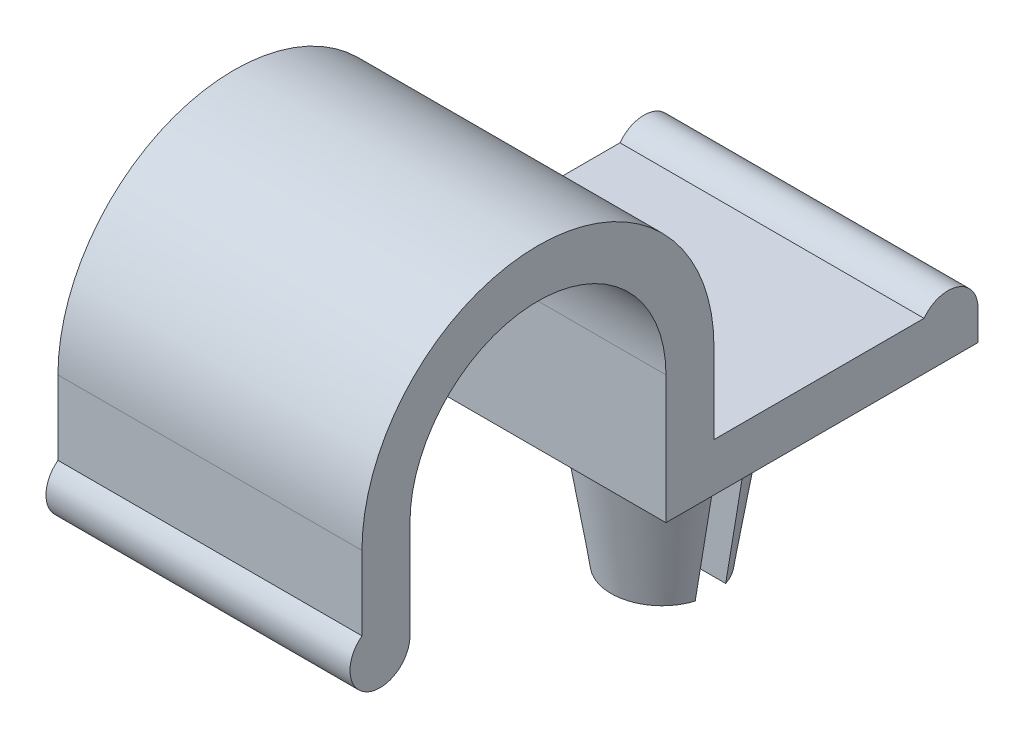
ISO-10303-21;
HEADER;
FILE_DESCRIPTION(('STEP AP214'),'2;1');
FILE_NAME('part.step','',(''),(''),'','','');
FILE_SCHEMA(('AUTOMOTIVE_DESIGN { 1 0 10303 214 1 1 1 1 }'));
ENDSEC;
DATA;
#1=APPLICATION_CONTEXT('core data for automotive mechanical design processes');
#2=APPLICATION_PROTOCOL_DEFINITION('international standard','automotive_design',2000,#1);
#3=PRODUCT_CONTEXT('',#1,'mechanical');
#4=PRODUCT('Part','Part','',(#3));
#5=PRODUCT_RELATED_PRODUCT_CATEGORY('part','',(#4));
#6=PRODUCT_DEFINITION_FORMATION('','',#4);
#7=PRODUCT_DEFINITION_CONTEXT('part definition',#1,'design');
#8=PRODUCT_DEFINITION('design','',#6,#7);
#9=PRODUCT_DEFINITION_SHAPE('','',#8);
#10=(LENGTH_UNIT() NAMED_UNIT(*) SI_UNIT(.MILLI.,.METRE.));
#11=(NAMED_UNIT(*) PLANE_ANGLE_UNIT() SI_UNIT($,.RADIAN.));
#12=(NAMED_UNIT(*) SI_UNIT($,.STERADIAN.) SOLID_ANGLE_UNIT());
#13=UNCERTAINTY_MEASURE_WITH_UNIT(LENGTH_MEASURE(1.E-05),#10,'distance_accuracy_value','');
#14=(GEOMETRIC_REPRESENTATION_CONTEXT(3) GLOBAL_UNCERTAINTY_ASSIGNED_CONTEXT((#13)) GLOBAL_UNIT_ASSIGNED_CONTEXT((#10,
#11,#12)) REPRESENTATION_CONTEXT('',''));
#15=CARTESIAN_POINT('',(0.,0.,0.));
#16=DIRECTION('',(0.,0.,1.));
#17=DIRECTION('',(1.,0.,0.));
#18=AXIS2_PLACEMENT_3D('',#15,#16,#17);
#19=CARTESIAN_POINT('',(0.,-4.851,-5.15));
#20=DIRECTION('',(0.,1.,0.));
#21=DIRECTION('',(0.,0.,1.));
#22=AXIS2_PLACEMENT_3D('',#19,#20,#21);
#23=PLANE('',#22);
#24=DIRECTION('',(-1.,0.,0.));
#25=VECTOR('',#24,1.);
#26=CARTESIAN_POINT('',(0.,-4.851,-7.281));
#27=LINE('',#26,#25);
#28=CARTESIAN_POINT('',(1.7080219553624,-4.851,-7.281));
#29=VERTEX_POINT('',#28);
#30=CARTESIAN_POINT('',(1.45080632752963,-4.851,-7.281));
#31=VERTEX_POINT('',#30);
#32=EDGE_CURVE('E281',#29,#31,#27,.T.);
#33=ORIENTED_EDGE('',*,*,#32,.F.);
#34=CARTESIAN_POINT('',(0.,-4.851,-6.9));
#35=DIRECTION('',(0.,-1.,0.));
#36=DIRECTION('',(0.,0.,-1.));
#37=AXIS2_PLACEMENT_3D('',#34,#35,#36);
#38=CIRCLE('',#37,1.75);
#39=CARTESIAN_POINT('',(-1.7080219553624,-4.851,-7.281));
#40=VERTEX_POINT('',#39);
#41=EDGE_CURVE('E301',#40,#29,#38,.T.);
#42=ORIENTED_EDGE('',*,*,#41,.F.);
#43=CARTESIAN_POINT('',(-1.45080632752963,-4.851,-7.281));
#44=VERTEX_POINT('',#43);
#45=EDGE_CURVE('E285',#44,#40,#27,.T.);
#46=ORIENTED_EDGE('',*,*,#45,.F.);
#47=CARTESIAN_POINT('',(0.,-4.851,-6.9));
#48=DIRECTION('',(0.,-1.,0.));
#49=DIRECTION('',(0.,0.,-1.));
#50=AXIS2_PLACEMENT_3D('',#47,#48,#49);
#51=CIRCLE('',#50,1.5);
#52=EDGE_CURVE('E305',#44,#31,#51,.T.);
#53=ORIENTED_EDGE('',*,*,#52,.T.);
#54=EDGE_LOOP('',(#33,#42,#46,#53));
#55=FACE_BOUND('',#54,.T.);
#56=ADVANCED_FACE('F36',(#55),#23,.T.);
#57=CARTESIAN_POINT('',(0.,-7.851,-6.9));
#58=DIRECTION('',(0.,1.,0.));
#59=DIRECTION('',(0.,0.,1.));
#60=AXIS2_PLACEMENT_3D('',#57,#58,#59);
#61=CONICAL_SURFACE('',#60,1.27,0.158655262186401);
#62=CARTESIAN_POINT('',(-0.890278523595278,-9.73613459988966,-7.281));
#63=CARTESIAN_POINT('',(-0.938041432508905,-9.46150185775553,-7.281));
#64=CARTESIAN_POINT('',(-0.985293739056163,-9.18678117733999,-7.281));
#65=CARTESIAN_POINT('',(-1.07903998334567,-8.63721103151004,-7.281));
#66=CARTESIAN_POINT('',(-1.12553392297273,-8.36236156641744,-7.281));
#67=CARTESIAN_POINT('',(-1.20641442373388,-7.88160254737788,-7.281));
#68=CARTESIAN_POINT('',(-1.24090973672328,-7.67571123061958,-7.281));
#69=CARTESIAN_POINT('',(-1.33840204237879,-7.09190160372883,-7.281));
#70=CARTESIAN_POINT('',(-1.40113905922128,-6.71393986590751,-7.281));
#71=CARTESIAN_POINT('',(-1.5261278012019,-5.95793592096705,-7.281));
#72=CARTESIAN_POINT('',(-1.5883795258562,-5.57989371376807,-7.281));
#73=CARTESIAN_POINT('',(-1.76609832110471,-4.4976408297803,-7.281));
#74=CARTESIAN_POINT('',(-1.88115016206371,-3.79336198928885,-7.281));
#75=CARTESIAN_POINT('',(-2.11060056427418,-2.38469774926164,-7.281));
#76=CARTESIAN_POINT('',(-2.22499912521735,-1.68031234967576,-7.281));
#77=CARTESIAN_POINT('',(-2.45338420312815,-0.271480262471609,-7.281));
#78=CARTESIAN_POINT('',(-2.56737072321955,0.432966424640384,-7.281));
#79=CARTESIAN_POINT('',(-2.79505928200441,1.84190503750387,-7.281));
#80=CARTESIAN_POINT('',(-2.9087613209902,2.54639696320811,-7.281));
#81=CARTESIAN_POINT('',(-3.02238458080445,3.25090153245999,-7.281));
#82=B_SPLINE_CURVE_WITH_KNOTS('',3,(#62,#63,#64,#65,#66,#67,#68,#69,#70,#71,#72,#73,#74,#75,#76,
#77,#78,#79,#80,#81),.UNSPECIFIED.,.F.,.F.,(4,2,2,2,2,2,2,2,2,4),(0.,0.836263797797176,
1.6725255168779,2.2988084845141,3.44820731588795,4.59760729303429,6.73845001030268,
8.87929373787069,11.0201212011299,13.1609464635406),.UNSPECIFIED.);
#83=CARTESIAN_POINT('',(-1.21150278579952,-7.851,-7.281));
#84=VERTEX_POINT('',#83);
#85=EDGE_CURVE('E287',#40,#84,#82,.F.);
#86=ORIENTED_EDGE('',*,*,#85,.F.);
#87=ORIENTED_EDGE('',*,*,#41,.T.);
#88=CARTESIAN_POINT('',(0.890278523595278,-9.73613459988966,-7.281));
#89=CARTESIAN_POINT('',(0.938041432508905,-9.46150185775553,-7.281));
#90=CARTESIAN_POINT('',(0.985293739056163,-9.18678117733999,-7.281));
#91=CARTESIAN_POINT('',(1.07903998334567,-8.63721103151004,-7.281));
#92=CARTESIAN_POINT('',(1.12553392297273,-8.36236156641744,-7.281));
#93=CARTESIAN_POINT('',(1.20641442373388,-7.88160254737788,-7.281));
#94=CARTESIAN_POINT('',(1.24090973672328,-7.67571123061958,-7.281));
#95=CARTESIAN_POINT('',(1.33840204237879,-7.09190160372883,-7.281));
#96=CARTESIAN_POINT('',(1.40113905922128,-6.71393986590751,-7.281));
#97=CARTESIAN_POINT('',(1.5261278012019,-5.95793592096705,-7.281));
#98=CARTESIAN_POINT('',(1.5883795258562,-5.57989371376807,-7.281));
#99=CARTESIAN_POINT('',(1.76609832110471,-4.4976408297803,-7.281));
#100=CARTESIAN_POINT('',(1.88115016206371,-3.79336198928885,-7.281));
#101=CARTESIAN_POINT('',(2.11060056427418,-2.38469774926164,-7.281));
#102=CARTESIAN_POINT('',(2.22499912521735,-1.68031234967576,-7.281));
#103=CARTESIAN_POINT('',(2.45338420312815,-0.271480262471609,-7.281));
#104=CARTESIAN_POINT('',(2.56737072321955,0.432966424640384,-7.281));
#105=CARTESIAN_POINT('',(2.79505928200441,1.84190503750387,-7.281));
#106=CARTESIAN_POINT('',(2.9087613209902,2.54639696320811,-7.281));
#107=CARTESIAN_POINT('',(3.02238458080445,3.25090153245999,-7.281));
#108=B_SPLINE_CURVE_WITH_KNOTS('',3,(#88,#89,#90,#91,#92,#93,#94,#95,#96,#97,#98,#99,#100,#101,
#102,#103,#104,#105,#106,#107),.UNSPECIFIED.,.F.,.F.,(4,2,2,2,2,2,2,2,2,4),(0.,
0.836263797797176,1.6725255168779,2.2988084845141,3.44820731588795,4.59760729303429,
6.73845001030268,8.87929373787069,11.0201212011299,13.1609464635406),.UNSPECIFIED.);
#109=CARTESIAN_POINT('',(1.21150278579952,-7.851,-7.281));
#110=VERTEX_POINT('',#109);
#111=EDGE_CURVE('E274',#110,#29,#108,.T.);
#112=ORIENTED_EDGE('',*,*,#111,.F.);
#113=CARTESIAN_POINT('',(0.,-7.851,-6.9));
#114=DIRECTION('',(0.,-1.,0.));
#115=DIRECTION('',(0.,0.,-1.));
#116=AXIS2_PLACEMENT_3D('',#113,#114,#115);
#117=CIRCLE('',#116,1.27);
#118=EDGE_CURVE('E297',#84,#110,#117,.T.);
#119=ORIENTED_EDGE('',*,*,#118,.F.);
#120=EDGE_LOOP('',(#86,#87,#112,#119));
#121=FACE_BOUND('',#120,.T.);
#122=ADVANCED_FACE('F269',(#121),#61,.T.);
#123=CARTESIAN_POINT('',(0.,-7.851,-6.9));
#124=DIRECTION('',(0.,-1.,0.));
#125=DIRECTION('',(0.,0.,-1.));
#126=AXIS2_PLACEMENT_3D('',#123,#124,#125);
#127=PLANE('',#126);
#128=DIRECTION('',(1.,0.,0.));
#129=VECTOR('',#128,1.);
#130=CARTESIAN_POINT('',(0.,-7.851,-7.281));
#131=LINE('',#130,#129);
#132=EDGE_CURVE('E217',#84,#110,#131,.T.);
#133=ORIENTED_EDGE('',*,*,#132,.F.);
#134=ORIENTED_EDGE('',*,*,#118,.T.);
#135=EDGE_LOOP('',(#133,#134));
#136=FACE_BOUND('',#135,.T.);
#137=ADVANCED_FACE('F371',(#136),#127,.T.);
#138=CARTESIAN_POINT('',(-3.8,-3.2,-3.2));
#139=DIRECTION('',(0.,1.,0.));
#140=DIRECTION('',(0.,0.,1.));
#141=AXIS2_PLACEMENT_3D('',#138,#139,#140);
#142=PLANE('',#141);
#143=CARTESIAN_POINT('',(0.,-3.2,-6.9));
#144=DIRECTION('',(0.,-1.,0.));
#145=DIRECTION('',(0.,0.,-1.));
#146=AXIS2_PLACEMENT_3D('',#143,#144,#145);
#147=CIRCLE('',#146,1.5);
#148=CARTESIAN_POINT('',(0.,-3.2,-8.4));
#149=VERTEX_POINT('',#148);
#150=EDGE_CURVE('E173',#149,#149,#147,.T.);
#151=ORIENTED_EDGE('',*,*,#150,.F.);
#152=EDGE_LOOP('',(#151));
#153=FACE_BOUND('',#152,.T.);
#154=DIRECTION('',(0.,0.,1.));
#155=VECTOR('',#154,1.);
#156=CARTESIAN_POINT('',(3.8,-3.2,-3.2));
#157=LINE('',#156,#155);
#158=CARTESIAN_POINT('',(3.8,-3.2,-11.));
#159=VERTEX_POINT('',#158);
#160=CARTESIAN_POINT('',(3.8,-3.2,-3.2));
#161=VERTEX_POINT('',#160);
#162=EDGE_CURVE('E169',#159,#161,#157,.T.);
#163=ORIENTED_EDGE('',*,*,#162,.T.);
#164=DIRECTION('',(1.,0.,0.));
#165=VECTOR('',#164,1.);
#166=CARTESIAN_POINT('',(-3.8,-3.2,-3.2));
#167=LINE('',#166,#165);
#168=CARTESIAN_POINT('',(-3.8,-3.2,-3.2));
#169=VERTEX_POINT('',#168);
#170=EDGE_CURVE('E213',#169,#161,#167,.T.);
#171=ORIENTED_EDGE('',*,*,#170,.F.);
#172=DIRECTION('',(0.,0.,1.));
#173=VECTOR('',#172,1.);
#174=CARTESIAN_POINT('',(-3.8,-3.2,-3.2));
#175=LINE('',#174,#173);
#176=CARTESIAN_POINT('',(-3.8,-3.2,-11.));
#177=VERTEX_POINT('',#176);
#178=EDGE_CURVE('E191',#177,#169,#175,.T.);
#179=ORIENTED_EDGE('',*,*,#178,.F.);
#180=DIRECTION('',(1.,0.,0.));
#181=VECTOR('',#180,1.);
#182=CARTESIAN_POINT('',(-3.8,-3.2,-11.));
#183=LINE('',#182,#181);
#184=EDGE_CURVE('E165',#177,#159,#183,.T.);
#185=ORIENTED_EDGE('',*,*,#184,.T.);
#186=EDGE_LOOP('',(#163,#171,#179,#185));
#187=FACE_BOUND('',#186,.T.);
#188=ADVANCED_FACE('F38',(#153,#187),#142,.F.);
#189=CARTESIAN_POINT('',(-3.8,0.,-3.2));
#190=DIRECTION('',(0.,0.,-1.));
#191=DIRECTION('',(0.,1.,0.));
#192=AXIS2_PLACEMENT_3D('',#189,#190,#191);
#193=PLANE('',#192);
#194=DIRECTION('',(0.,1.,0.));
#195=VECTOR('',#194,1.);
#196=CARTESIAN_POINT('',(3.8,0.,-3.2));
#197=LINE('',#196,#195);
#198=CARTESIAN_POINT('',(3.8,0.,-3.2));
#199=VERTEX_POINT('',#198);
#200=EDGE_CURVE('E172',#161,#199,#197,.T.);
#201=ORIENTED_EDGE('',*,*,#200,.T.);
#202=DIRECTION('',(1.,0.,0.));
#203=VECTOR('',#202,1.);
#204=CARTESIAN_POINT('',(-3.8,0.,-3.2));
#205=LINE('',#204,#203);
#206=CARTESIAN_POINT('',(-3.8,0.,-3.2));
#207=VERTEX_POINT('',#206);
#208=EDGE_CURVE('E210',#207,#199,#205,.T.);
#209=ORIENTED_EDGE('',*,*,#208,.F.);
#210=DIRECTION('',(0.,1.,0.));
#211=VECTOR('',#210,1.);
#212=CARTESIAN_POINT('',(-3.8,0.,-3.2));
#213=LINE('',#212,#211);
#214=EDGE_CURVE('E117',#169,#207,#213,.T.);
#215=ORIENTED_EDGE('',*,*,#214,.F.);
#216=ORIENTED_EDGE('',*,*,#170,.T.);
#217=EDGE_LOOP('',(#201,#209,#215,#216));
#218=FACE_BOUND('',#217,.T.);
#219=ADVANCED_FACE('F341',(#218),#193,.F.);
#220=CARTESIAN_POINT('',(-3.8,0.,0.));
#221=DIRECTION('',(1.,0.,0.));
#222=DIRECTION('',(0.,0.,-1.));
#223=AXIS2_PLACEMENT_3D('',#220,#221,#222);
#224=CYLINDRICAL_SURFACE('',#223,3.2);
#225=CARTESIAN_POINT('',(3.8,0.,0.));
#226=DIRECTION('',(1.,0.,0.));
#227=DIRECTION('',(0.,0.,1.));
#228=AXIS2_PLACEMENT_3D('',#225,#226,#227);
#229=CIRCLE('',#228,3.2);
#230=CARTESIAN_POINT('',(3.8,0.,3.2));
#231=VERTEX_POINT('',#230);
#232=EDGE_CURVE('E175',#199,#231,#229,.T.);
#233=ORIENTED_EDGE('',*,*,#232,.T.);
#234=DIRECTION('',(1.,0.,0.));
#235=VECTOR('',#234,1.);
#236=CARTESIAN_POINT('',(-3.8,0.,3.2));
#237=LINE('',#236,#235);
#238=CARTESIAN_POINT('',(-3.8,0.,3.2));
#239=VERTEX_POINT('',#238);
#240=EDGE_CURVE('E207',#239,#231,#237,.T.);
#241=ORIENTED_EDGE('',*,*,#240,.F.);
#242=CARTESIAN_POINT('',(-3.8,0.,0.));
#243=DIRECTION('',(1.,0.,0.));
#244=DIRECTION('',(0.,0.,1.));
#245=AXIS2_PLACEMENT_3D('',#242,#243,#244);
#246=CIRCLE('',#245,3.2);
#247=EDGE_CURVE('E313',#207,#239,#246,.T.);
#248=ORIENTED_EDGE('',*,*,#247,.F.);
#249=ORIENTED_EDGE('',*,*,#208,.T.);
#250=EDGE_LOOP('',(#233,#241,#248,#249));
#251=FACE_BOUND('',#250,.T.);
#252=ADVANCED_FACE('F344',(#251),#224,.F.);
#253=CARTESIAN_POINT('',(-3.8,0.,3.2));
#254=DIRECTION('',(0.,0.,1.));
#255=DIRECTION('',(0.,-1.,0.));
#256=AXIS2_PLACEMENT_3D('',#253,#254,#255);
#257=PLANE('',#256);
#258=DIRECTION('',(0.,-1.,0.));
#259=VECTOR('',#258,1.);
#260=CARTESIAN_POINT('',(3.8,0.,3.2));
#261=LINE('',#260,#259);
#262=CARTESIAN_POINT('',(3.8,-2.45,3.2));
#263=VERTEX_POINT('',#262);
#264=EDGE_CURVE('E177',#231,#263,#261,.T.);
#265=ORIENTED_EDGE('',*,*,#264,.T.);
#266=DIRECTION('',(1.,0.,0.));
#267=VECTOR('',#266,1.);
#268=CARTESIAN_POINT('',(-3.8,-2.45,3.2));
#269=LINE('',#268,#267);
#270=CARTESIAN_POINT('',(-3.8,-2.45,3.2));
#271=VERTEX_POINT('',#270);
#272=EDGE_CURVE('E204',#271,#263,#269,.T.);
#273=ORIENTED_EDGE('',*,*,#272,.F.);
#274=DIRECTION('',(0.,-1.,0.));
#275=VECTOR('',#274,1.);
#276=CARTESIAN_POINT('',(-3.8,0.,3.2));
#277=LINE('',#276,#275);
#278=EDGE_CURVE('E315',#239,#271,#277,.T.);
#279=ORIENTED_EDGE('',*,*,#278,.F.);
#280=ORIENTED_EDGE('',*,*,#240,.T.);
#281=EDGE_LOOP('',(#265,#273,#279,#280));
#282=FACE_BOUND('',#281,.T.);
#283=ADVANCED_FACE('F349',(#282),#257,.F.);
#284=CARTESIAN_POINT('',(-3.8,-2.45,3.95));
#285=DIRECTION('',(1.,0.,0.));
#286=DIRECTION('',(0.,0.,-1.));
#287=AXIS2_PLACEMENT_3D('',#284,#285,#286);
#288=CYLINDRICAL_SURFACE('',#287,0.75);
#289=CARTESIAN_POINT('',(3.8,-2.45,3.95));
#290=DIRECTION('',(-1.,0.,0.));
#291=DIRECTION('',(0.,0.,1.));
#292=AXIS2_PLACEMENT_3D('',#289,#290,#291);
#293=CIRCLE('',#292,0.75);
#294=CARTESIAN_POINT('',(3.8,-1.85,4.4));
#295=VERTEX_POINT('',#294);
#296=EDGE_CURVE('E179',#263,#295,#293,.T.);
#297=ORIENTED_EDGE('',*,*,#296,.T.);
#298=DIRECTION('',(1.,0.,0.));
#299=VECTOR('',#298,1.);
#300=CARTESIAN_POINT('',(-3.8,-1.85,4.4));
#301=LINE('',#300,#299);
#302=CARTESIAN_POINT('',(-3.8,-1.85,4.4));
#303=VERTEX_POINT('',#302);
#304=EDGE_CURVE('E201',#303,#295,#301,.T.);
#305=ORIENTED_EDGE('',*,*,#304,.F.);
#306=CARTESIAN_POINT('',(-3.8,-2.45,3.95));
#307=DIRECTION('',(-1.,0.,0.));
#308=DIRECTION('',(0.,0.,1.));
#309=AXIS2_PLACEMENT_3D('',#306,#307,#308);
#310=CIRCLE('',#309,0.75);
#311=EDGE_CURVE('E317',#271,#303,#310,.T.);
#312=ORIENTED_EDGE('',*,*,#311,.F.);
#313=ORIENTED_EDGE('',*,*,#272,.T.);
#314=EDGE_LOOP('',(#297,#305,#312,#313));
#315=FACE_BOUND('',#314,.T.);
#316=ADVANCED_FACE('F353',(#315),#288,.T.);
#317=CARTESIAN_POINT('',(-3.8,0.,4.4));
#318=DIRECTION('',(0.,0.,-1.));
#319=DIRECTION('',(-1.,0.,0.));
#320=AXIS2_PLACEMENT_3D('',#317,#318,#319);
#321=PLANE('',#320);
#322=DIRECTION('',(0.,1.,0.));
#323=VECTOR('',#322,1.);
#324=CARTESIAN_POINT('',(3.8,0.,4.4));
#325=LINE('',#324,#323);
#326=CARTESIAN_POINT('',(3.8,0.,4.4));
#327=VERTEX_POINT('',#326);
#328=EDGE_CURVE('E181',#295,#327,#325,.T.);
#329=ORIENTED_EDGE('',*,*,#328,.T.);
#330=DIRECTION('',(1.,0.,0.));
#331=VECTOR('',#330,1.);
#332=CARTESIAN_POINT('',(-3.8,0.,4.4));
#333=LINE('',#332,#331);
#334=CARTESIAN_POINT('',(-3.8,0.,4.4));
#335=VERTEX_POINT('',#334);
#336=EDGE_CURVE('E198',#335,#327,#333,.T.);
#337=ORIENTED_EDGE('',*,*,#336,.F.);
#338=DIRECTION('',(0.,1.,0.));
#339=VECTOR('',#338,1.);
#340=CARTESIAN_POINT('',(-3.8,0.,4.4));
#341=LINE('',#340,#339);
#342=EDGE_CURVE('E319',#303,#335,#341,.T.);
#343=ORIENTED_EDGE('',*,*,#342,.F.);
#344=ORIENTED_EDGE('',*,*,#304,.T.);
#345=EDGE_LOOP('',(#329,#337,#343,#344));
#346=FACE_BOUND('',#345,.T.);
#347=ADVANCED_FACE('F357',(#346),#321,.F.);
#348=CARTESIAN_POINT('',(-3.8,0.,0.));
#349=DIRECTION('',(1.,0.,0.));
#350=DIRECTION('',(0.,0.,-1.));
#351=AXIS2_PLACEMENT_3D('',#348,#349,#350);
#352=CYLINDRICAL_SURFACE('',#351,4.4);
#353=CARTESIAN_POINT('',(3.8,0.,0.));
#354=DIRECTION('',(-1.,0.,0.));
#355=DIRECTION('',(0.,0.,1.));
#356=AXIS2_PLACEMENT_3D('',#353,#354,#355);
#357=CIRCLE('',#356,4.4);
#358=CARTESIAN_POINT('',(3.8,0.,-4.4));
#359=VERTEX_POINT('',#358);
#360=EDGE_CURVE('E183',#327,#359,#357,.T.);
#361=ORIENTED_EDGE('',*,*,#360,.T.);
#362=DIRECTION('',(1.,0.,0.));
#363=VECTOR('',#362,1.);
#364=CARTESIAN_POINT('',(-3.8,0.,-4.4));
#365=LINE('',#364,#363);
#366=CARTESIAN_POINT('',(-3.8,0.,-4.4));
#367=VERTEX_POINT('',#366);
#368=EDGE_CURVE('E195',#367,#359,#365,.T.);
#369=ORIENTED_EDGE('',*,*,#368,.F.);
#370=CARTESIAN_POINT('',(-3.8,0.,0.));
#371=DIRECTION('',(-1.,0.,0.));
#372=DIRECTION('',(0.,0.,1.));
#373=AXIS2_PLACEMENT_3D('',#370,#371,#372);
#374=CIRCLE('',#373,4.4);
#375=EDGE_CURVE('E321',#335,#367,#374,.T.);
#376=ORIENTED_EDGE('',*,*,#375,.F.);
#377=ORIENTED_EDGE('',*,*,#336,.T.);
#378=EDGE_LOOP('',(#361,#369,#376,#377));
#379=FACE_BOUND('',#378,.T.);
#380=ADVANCED_FACE('F327',(#379),#352,.T.);
#381=CARTESIAN_POINT('',(-3.8,0.,-4.4));
#382=DIRECTION('',(0.,0.,1.));
#383=DIRECTION('',(1.,0.,0.));
#384=AXIS2_PLACEMENT_3D('',#381,#382,#383);
#385=PLANE('',#384);
#386=DIRECTION('',(0.,-1.,0.));
#387=VECTOR('',#386,1.);
#388=CARTESIAN_POINT('',(3.8,0.,-4.4));
#389=LINE('',#388,#387);
#390=CARTESIAN_POINT('',(3.8,-2.,-4.4));
#391=VERTEX_POINT('',#390);
#392=EDGE_CURVE('E185',#359,#391,#389,.T.);
#393=ORIENTED_EDGE('',*,*,#392,.T.);
#394=DIRECTION('',(1.,0.,0.));
#395=VECTOR('',#394,1.);
#396=CARTESIAN_POINT('',(-3.8,-2.,-4.4));
#397=LINE('',#396,#395);
#398=CARTESIAN_POINT('',(-3.8,-2.,-4.4));
#399=VERTEX_POINT('',#398);
#400=EDGE_CURVE('E160',#399,#391,#397,.T.);
#401=ORIENTED_EDGE('',*,*,#400,.F.);
#402=DIRECTION('',(0.,-1.,0.));
#403=VECTOR('',#402,1.);
#404=CARTESIAN_POINT('',(-3.8,0.,-4.4));
#405=LINE('',#404,#403);
#406=EDGE_CURVE('E148',#367,#399,#405,.T.);
#407=ORIENTED_EDGE('',*,*,#406,.F.);
#408=ORIENTED_EDGE('',*,*,#368,.T.);
#409=EDGE_LOOP('',(#393,#401,#407,#408));
#410=FACE_BOUND('',#409,.T.);
#411=ADVANCED_FACE('F331',(#410),#385,.F.);
#412=CARTESIAN_POINT('',(-3.8,-2.,-9.65));
#413=DIRECTION('',(0.,-1.,0.));
#414=DIRECTION('',(0.,0.,-1.));
#415=AXIS2_PLACEMENT_3D('',#412,#413,#414);
#416=PLANE('',#415);
#417=DIRECTION('',(0.,0.,-1.));
#418=VECTOR('',#417,1.);
#419=CARTESIAN_POINT('',(3.8,-2.,-9.65));
#420=LINE('',#419,#418);
#421=CARTESIAN_POINT('',(3.8,-2.,-9.65));
#422=VERTEX_POINT('',#421);
#423=EDGE_CURVE('E157',#391,#422,#420,.T.);
#424=ORIENTED_EDGE('',*,*,#423,.T.);
#425=DIRECTION('',(1.,0.,0.));
#426=VECTOR('',#425,1.);
#427=CARTESIAN_POINT('',(-3.8,-2.,-9.65));
#428=LINE('',#427,#426);
#429=CARTESIAN_POINT('',(-3.8,-2.,-9.65));
#430=VERTEX_POINT('',#429);
#431=EDGE_CURVE('E154',#430,#422,#428,.T.);
#432=ORIENTED_EDGE('',*,*,#431,.F.);
#433=DIRECTION('',(0.,0.,-1.));
#434=VECTOR('',#433,1.);
#435=CARTESIAN_POINT('',(-3.8,-2.,-9.65));
#436=LINE('',#435,#434);
#437=EDGE_CURVE('E141',#399,#430,#436,.T.);
#438=ORIENTED_EDGE('',*,*,#437,.F.);
#439=ORIENTED_EDGE('',*,*,#400,.T.);
#440=EDGE_LOOP('',(#424,#432,#438,#439));
#441=FACE_BOUND('',#440,.T.);
#442=ADVANCED_FACE('F155',(#441),#416,.F.);
#443=CARTESIAN_POINT('',(-3.8,-2.45,-10.25));
#444=DIRECTION('',(1.,0.,0.));
#445=DIRECTION('',(0.,0.,-1.));
#446=AXIS2_PLACEMENT_3D('',#443,#444,#445);
#447=CYLINDRICAL_SURFACE('',#446,0.750000000000001);
#448=CARTESIAN_POINT('',(3.8,-2.45,-10.25));
#449=DIRECTION('',(-1.,0.,0.));
#450=DIRECTION('',(0.,0.,1.));
#451=AXIS2_PLACEMENT_3D('',#448,#449,#450);
#452=CIRCLE('',#451,0.750000000000001);
#453=CARTESIAN_POINT('',(3.8,-2.45,-11.));
#454=VERTEX_POINT('',#453);
#455=EDGE_CURVE('E188',#422,#454,#452,.T.);
#456=ORIENTED_EDGE('',*,*,#455,.T.);
#457=DIRECTION('',(1.,0.,0.));
#458=VECTOR('',#457,1.);
#459=CARTESIAN_POINT('',(-3.8,-2.45,-11.));
#460=LINE('',#459,#458);
#461=CARTESIAN_POINT('',(-3.8,-2.45,-11.));
#462=VERTEX_POINT('',#461);
#463=EDGE_CURVE('E161',#462,#454,#460,.T.);
#464=ORIENTED_EDGE('',*,*,#463,.F.);
#465=CARTESIAN_POINT('',(-3.8,-2.45,-10.25));
#466=DIRECTION('',(-1.,0.,0.));
#467=DIRECTION('',(0.,0.,1.));
#468=AXIS2_PLACEMENT_3D('',#465,#466,#467);
#469=CIRCLE('',#468,0.750000000000001);
#470=EDGE_CURVE('E145',#430,#462,#469,.T.);
#471=ORIENTED_EDGE('',*,*,#470,.F.);
#472=ORIENTED_EDGE('',*,*,#431,.T.);
#473=EDGE_LOOP('',(#456,#464,#471,#472));
#474=FACE_BOUND('',#473,.T.);
#475=ADVANCED_FACE('F163',(#474),#447,.T.);
#476=CARTESIAN_POINT('',(-3.8,-3.2,-11.));
#477=DIRECTION('',(0.,0.,1.));
#478=DIRECTION('',(1.,0.,0.));
#479=AXIS2_PLACEMENT_3D('',#476,#477,#478);
#480=PLANE('',#479);
#481=DIRECTION('',(0.,-1.,0.));
#482=VECTOR('',#481,1.);
#483=CARTESIAN_POINT('',(3.8,-3.2,-11.));
#484=LINE('',#483,#482);
#485=EDGE_CURVE('E108',#454,#159,#484,.T.);
#486=ORIENTED_EDGE('',*,*,#485,.T.);
#487=ORIENTED_EDGE('',*,*,#184,.F.);
#488=DIRECTION('',(0.,-1.,0.));
#489=VECTOR('',#488,1.);
#490=CARTESIAN_POINT('',(-3.8,-3.2,-11.));
#491=LINE('',#490,#489);
#492=EDGE_CURVE('E66',#462,#177,#491,.T.);
#493=ORIENTED_EDGE('',*,*,#492,.F.);
#494=ORIENTED_EDGE('',*,*,#463,.T.);
#495=EDGE_LOOP('',(#486,#487,#493,#494));
#496=FACE_BOUND('',#495,.T.);
#497=ADVANCED_FACE('F335',(#496),#480,.F.);
#498=CARTESIAN_POINT('',(-3.8,-2.45,-10.25));
#499=DIRECTION('',(-1.,0.,0.));
#500=DIRECTION('',(0.,0.,1.));
#501=AXIS2_PLACEMENT_3D('',#498,#499,#500);
#502=PLANE('',#501);
#503=ORIENTED_EDGE('',*,*,#178,.T.);
#504=ORIENTED_EDGE('',*,*,#214,.T.);
#505=ORIENTED_EDGE('',*,*,#247,.T.);
#506=ORIENTED_EDGE('',*,*,#278,.T.);
#507=ORIENTED_EDGE('',*,*,#311,.T.);
#508=ORIENTED_EDGE('',*,*,#342,.T.);
#509=ORIENTED_EDGE('',*,*,#375,.T.);
#510=ORIENTED_EDGE('',*,*,#406,.T.);
#511=ORIENTED_EDGE('',*,*,#437,.T.);
#512=ORIENTED_EDGE('',*,*,#470,.T.);
#513=ORIENTED_EDGE('',*,*,#492,.T.);
#514=EDGE_LOOP('',(#503,#504,#505,#506,#507,#508,#509,#510,#511,#512,#513));
#515=FACE_BOUND('',#514,.T.);
#516=ADVANCED_FACE('F143',(#515),#502,.T.);
#517=CARTESIAN_POINT('',(3.8,-2.45,-10.25));
#518=DIRECTION('',(-1.,0.,0.));
#519=DIRECTION('',(0.,0.,1.));
#520=AXIS2_PLACEMENT_3D('',#517,#518,#519);
#521=PLANE('',#520);
#522=ORIENTED_EDGE('',*,*,#162,.F.);
#523=ORIENTED_EDGE('',*,*,#485,.F.);
#524=ORIENTED_EDGE('',*,*,#455,.F.);
#525=ORIENTED_EDGE('',*,*,#423,.F.);
#526=ORIENTED_EDGE('',*,*,#392,.F.);
#527=ORIENTED_EDGE('',*,*,#360,.F.);
#528=ORIENTED_EDGE('',*,*,#328,.F.);
#529=ORIENTED_EDGE('',*,*,#296,.F.);
#530=ORIENTED_EDGE('',*,*,#264,.F.);
#531=ORIENTED_EDGE('',*,*,#232,.F.);
#532=ORIENTED_EDGE('',*,*,#200,.F.);
#533=EDGE_LOOP('',(#522,#523,#524,#525,#526,#527,#528,#529,#530,#531,#532));
#534=FACE_BOUND('',#533,.T.);
#535=ADVANCED_FACE('F334',(#534),#521,.F.);
#536=CARTESIAN_POINT('',(0.,-3.2,-6.9));
#537=DIRECTION('',(0.,-1.,0.));
#538=DIRECTION('',(0.,0.,-1.));
#539=AXIS2_PLACEMENT_3D('',#536,#537,#538);
#540=CYLINDRICAL_SURFACE('',#539,1.5);
#541=DIRECTION('',(0.,-1.,0.));
#542=VECTOR('',#541,1.);
#543=CARTESIAN_POINT('',(-1.45080632752963,-3.2,-7.281));
#544=LINE('',#543,#542);
#545=CARTESIAN_POINT('',(-1.45080632752963,-3.787,-7.281));
#546=VERTEX_POINT('',#545);
#547=EDGE_CURVE('E294',#546,#44,#544,.T.);
#548=ORIENTED_EDGE('',*,*,#547,.F.);
#549=CARTESIAN_POINT('',(-1.45080632752963,-3.787,-6.519));
#550=CARTESIAN_POINT('',(-1.45078805876325,-3.76593359163224,-6.51898021181437));
#551=CARTESIAN_POINT('',(-1.4512647036703,-3.74488063931606,-6.52074585101482));
#552=CARTESIAN_POINT('',(-1.45306907413241,-3.70342626932325,-6.52769226470349));
#553=CARTESIAN_POINT('',(-1.45439503358234,-3.68302359164113,-6.53286595296493));
#554=CARTESIAN_POINT('',(-1.45776015815194,-3.64340447992512,-6.54647314204933));
#555=CARTESIAN_POINT('',(-1.45979924303376,-3.62418791272117,-6.5549062761445));
#556=CARTESIAN_POINT('',(-1.46435421314104,-3.58743462279419,-6.57477546122427));
#557=CARTESIAN_POINT('',(-1.46687023312475,-3.56989837696027,-6.58621236127753));
#558=CARTESIAN_POINT('',(-1.47216033231567,-3.53661386536997,-6.61204069978887));
#559=CARTESIAN_POINT('',(-1.47493861873509,-3.52090920936623,-6.62648748921445));
#560=CARTESIAN_POINT('',(-1.48040366347713,-3.49211663337953,-6.65780717349287));
#561=CARTESIAN_POINT('',(-1.48309040706132,-3.47902913312345,-6.67468045675038));
#562=CARTESIAN_POINT('',(-1.4881164369874,-3.45566331265285,-6.71067518731065));
#563=CARTESIAN_POINT('',(-1.49045015165085,-3.44542824222815,-6.72982555564943));
#564=CARTESIAN_POINT('',(-1.49445872551434,-3.42833965007128,-6.76964325557795));
#565=CARTESIAN_POINT('',(-1.49613371728685,-3.42148544784564,-6.79031028093559));
#566=CARTESIAN_POINT('',(-1.49860640463696,-3.41149336325074,-6.83211775294668));
#567=CARTESIAN_POINT('',(-1.49942167859464,-3.40828091193789,-6.85323931967963));
#568=CARTESIAN_POINT('',(-1.5001443828878,-3.40542930307337,-6.89573673615446));
#569=CARTESIAN_POINT('',(-1.50005193157495,-3.40578967968685,-6.91711255238364));
#570=CARTESIAN_POINT('',(-1.49898260407699,-3.41002026592393,-6.95899311484178));
#571=CARTESIAN_POINT('',(-1.49802603499195,-3.41380989040246,-6.97950659823888));
#572=CARTESIAN_POINT('',(-1.49535968702474,-3.4246616732236,-7.01959618751061));
#573=CARTESIAN_POINT('',(-1.49364987421703,-3.43172397896607,-7.03917225112052));
#574=CARTESIAN_POINT('',(-1.48963828847148,-3.44898512806708,-7.0770425112646));
#575=CARTESIAN_POINT('',(-1.48733117524443,-3.45921243889287,-7.09532314340295));
#576=CARTESIAN_POINT('',(-1.48237493434213,-3.48249144609045,-7.12993633383577));
#577=CARTESIAN_POINT('',(-1.47972575319679,-3.49554358423921,-7.14626858680124));
#578=CARTESIAN_POINT('',(-1.47428665122733,-3.52453095470252,-7.17700086357129));
#579=CARTESIAN_POINT('',(-1.47149486533328,-3.54053628252346,-7.19133450612419));
#580=CARTESIAN_POINT('',(-1.46615174618746,-3.5747572604159,-7.2171327372145));
#581=CARTESIAN_POINT('',(-1.46360047899156,-3.59297351457056,-7.2285965390039));
#582=CARTESIAN_POINT('',(-1.45901985255194,-3.63123567419435,-7.24837495642699));
#583=CARTESIAN_POINT('',(-1.45699353709425,-3.65129137565968,-7.25667133246128));
#584=CARTESIAN_POINT('',(-1.45373180937582,-3.69256510930243,-7.26974312669757));
#585=CARTESIAN_POINT('',(-1.45249521398683,-3.71378135078255,-7.27452381360598));
#586=CARTESIAN_POINT('',(-1.45142316947756,-3.74381872478612,-7.27864467524028));
#587=CARTESIAN_POINT('',(-1.45119222141734,-3.75243679528378,-7.27952805813466));
#588=CARTESIAN_POINT('',(-1.45088386297369,-3.76970187138451,-7.28070506588876));
#589=CARTESIAN_POINT('',(-1.45080620536829,-3.77834880783117,-7.28099964036966));
#590=CARTESIAN_POINT('',(-1.45080632752984,-3.78700000000001,-7.28100000000002));
#591=B_SPLINE_CURVE_WITH_KNOTS('',3,(#549,#550,#551,#552,#553,#554,#555,#556,#557,#558,#559,
#560,#561,#562,#563,#564,#565,#566,#567,#568,#569,#570,#571,#572,#573,#574,#575,#576,#577,#578,
#579,#580,#581,#582,#583,#584,#585,#586,#587,#588,#589,#590),.UNSPECIFIED.,.F.,.F.,(4,2,2,2,2,2,
2,2,2,2,2,2,2,2,2,2,2,2,2,2,4),(0.,0.0630992981823872,0.126067808780177,0.189029236706657,
0.252008481007428,0.316268401335156,0.380538619110236,0.44573601771679,0.510920288178883,
0.574744262809575,0.638559916009504,0.700913811006121,0.7632705146626,0.826205236911528,
0.889149808692817,0.953845193806709,1.01855829536126,1.0836386194763,1.148621212595,
1.17460290995016,1.20054267050369),.UNSPECIFIED.);
#592=CARTESIAN_POINT('',(-1.45080632752962,-3.787,-6.519));
#593=VERTEX_POINT('',#592);
#594=EDGE_CURVE('E11',#593,#546,#591,.T.);
#595=ORIENTED_EDGE('',*,*,#594,.F.);
#596=DIRECTION('',(0.,-1.,0.));
#597=VECTOR('',#596,1.);
#598=CARTESIAN_POINT('',(-1.45080632752963,-3.2,-6.519));
#599=LINE('',#598,#597);
#600=CARTESIAN_POINT('',(-1.45080632752963,-4.851,-6.519));
#601=VERTEX_POINT('',#600);
#602=EDGE_CURVE('E261',#601,#593,#599,.F.);
#603=ORIENTED_EDGE('',*,*,#602,.F.);
#604=CARTESIAN_POINT('',(1.45080632752963,-4.851,-6.519));
#605=VERTEX_POINT('',#604);
#606=EDGE_CURVE('E308',#605,#601,#51,.T.);
#607=ORIENTED_EDGE('',*,*,#606,.F.);
#608=DIRECTION('',(0.,-1.,0.));
#609=VECTOR('',#608,1.);
#610=CARTESIAN_POINT('',(1.45080632752963,-3.2,-6.519));
#611=LINE('',#610,#609);
#612=CARTESIAN_POINT('',(1.45080632752963,-3.787,-6.519));
#613=VERTEX_POINT('',#612);
#614=EDGE_CURVE('E260',#613,#605,#611,.T.);
#615=ORIENTED_EDGE('',*,*,#614,.F.);
#616=CARTESIAN_POINT('',(1.45080632752963,-3.787,-7.281));
#617=CARTESIAN_POINT('',(1.45078805876325,-3.76593359163224,-7.28101978818564));
#618=CARTESIAN_POINT('',(1.4512647036703,-3.74488063931606,-7.27925414898518));
#619=CARTESIAN_POINT('',(1.45306907413241,-3.70342626932325,-7.27230773529651));
#620=CARTESIAN_POINT('',(1.45439503358234,-3.68302359164113,-7.26713404703507));
#621=CARTESIAN_POINT('',(1.45776015815194,-3.64340447992512,-7.25352685795068));
#622=CARTESIAN_POINT('',(1.45979924303376,-3.62418791272117,-7.2450937238555));
#623=CARTESIAN_POINT('',(1.46435421314104,-3.58743462279419,-7.22522453877573));
#624=CARTESIAN_POINT('',(1.46687023312475,-3.56989837696027,-7.21378763872248));
#625=CARTESIAN_POINT('',(1.47216033231567,-3.53661386536997,-7.18795930021114));
#626=CARTESIAN_POINT('',(1.47493861873509,-3.52090920936623,-7.17351251078555));
#627=CARTESIAN_POINT('',(1.48040366347713,-3.49211663337953,-7.14219282650713));
#628=CARTESIAN_POINT('',(1.48309040706132,-3.47902913312345,-7.12531954324962));
#629=CARTESIAN_POINT('',(1.4881164369874,-3.45566331265285,-7.08932481268935));
#630=CARTESIAN_POINT('',(1.49045015165085,-3.44542824222815,-7.07017444435057));
#631=CARTESIAN_POINT('',(1.49445872551434,-3.42833965007128,-7.03035674442205));
#632=CARTESIAN_POINT('',(1.49613371728685,-3.42148544784564,-7.00968971906441));
#633=CARTESIAN_POINT('',(1.49860640463696,-3.41149336325074,-6.96788224705332));
#634=CARTESIAN_POINT('',(1.49942167859464,-3.40828091193789,-6.94676068032037));
#635=CARTESIAN_POINT('',(1.5001443828878,-3.40542930307337,-6.90426326384554));
#636=CARTESIAN_POINT('',(1.50005193157495,-3.40578967968685,-6.88288744761636));
#637=CARTESIAN_POINT('',(1.49898260407699,-3.41002026592393,-6.84100688515822));
#638=CARTESIAN_POINT('',(1.49802603499195,-3.41380989040246,-6.82049340176113));
#639=CARTESIAN_POINT('',(1.49535968702474,-3.4246616732236,-6.7804038124894));
#640=CARTESIAN_POINT('',(1.49364987421703,-3.43172397896607,-6.76082774887949));
#641=CARTESIAN_POINT('',(1.48963828847148,-3.44898512806708,-6.72295748873541));
#642=CARTESIAN_POINT('',(1.48733117524443,-3.45921243889287,-6.70467685659705));
#643=CARTESIAN_POINT('',(1.48237493434213,-3.48249144609045,-6.67006366616423));
#644=CARTESIAN_POINT('',(1.47972575319679,-3.49554358423921,-6.65373141319876));
#645=CARTESIAN_POINT('',(1.47428665122733,-3.52453095470252,-6.62299913642872));
#646=CARTESIAN_POINT('',(1.47149486533328,-3.54053628252346,-6.60866549387581));
#647=CARTESIAN_POINT('',(1.46615174618746,-3.5747572604159,-6.5828672627855));
#648=CARTESIAN_POINT('',(1.46360047899156,-3.59297351457056,-6.57140346099611));
#649=CARTESIAN_POINT('',(1.45901985255194,-3.63123567419435,-6.55162504357301));
#650=CARTESIAN_POINT('',(1.45699353709425,-3.65129137565968,-6.54332866753872));
#651=CARTESIAN_POINT('',(1.45373180937582,-3.69256510930243,-6.53025687330243));
#652=CARTESIAN_POINT('',(1.45249521398683,-3.71378135078255,-6.52547618639402));
#653=CARTESIAN_POINT('',(1.45142316947756,-3.74381872478612,-6.52135532475972));
#654=CARTESIAN_POINT('',(1.45119222141734,-3.75243679528378,-6.52047194186535));
#655=CARTESIAN_POINT('',(1.45088386297369,-3.76970187138451,-6.51929493411124));
#656=CARTESIAN_POINT('',(1.45080620536829,-3.77834880783117,-6.51900035963034));
#657=CARTESIAN_POINT('',(1.45080632752984,-3.78700000000001,-6.51899999999999));
#658=B_SPLINE_CURVE_WITH_KNOTS('',3,(#616,#617,#618,#619,#620,#621,#622,#623,#624,#625,#626,
#627,#628,#629,#630,#631,#632,#633,#634,#635,#636,#637,#638,#639,#640,#641,#642,#643,#644,#645,
#646,#647,#648,#649,#650,#651,#652,#653,#654,#655,#656,#657),.UNSPECIFIED.,.F.,.F.,(4,2,2,2,2,2,
2,2,2,2,2,2,2,2,2,2,2,2,2,2,4),(0.,0.0630992981823876,0.126067808780178,0.189029236706657,
0.252008481007428,0.316268401335156,0.380538619110236,0.445736017716791,0.510920288178883,
0.574744262809576,0.638559916009505,0.700913811006121,0.7632705146626,0.826205236911528,
0.889149808692817,0.953845193806709,1.01855829536126,1.0836386194763,1.148621212595,
1.17460290995016,1.20054267050369),.UNSPECIFIED.);
#659=CARTESIAN_POINT('',(1.45080632752963,-3.787,-7.281));
#660=VERTEX_POINT('',#659);
#661=EDGE_CURVE('E50',#660,#613,#658,.T.);
#662=ORIENTED_EDGE('',*,*,#661,.F.);
#663=DIRECTION('',(0.,-1.,0.));
#664=VECTOR('',#663,1.);
#665=CARTESIAN_POINT('',(1.45080632752963,-3.2,-7.281));
#666=LINE('',#665,#664);
#667=EDGE_CURVE('E284',#31,#660,#666,.F.);
#668=ORIENTED_EDGE('',*,*,#667,.F.);
#669=ORIENTED_EDGE('',*,*,#52,.F.);
#670=EDGE_LOOP('',(#548,#595,#603,#607,#615,#662,#668,#669));
#671=FACE_BOUND('',#670,.T.);
#672=ORIENTED_EDGE('',*,*,#150,.T.);
#673=EDGE_LOOP('',(#672));
#674=FACE_BOUND('',#673,.T.);
#675=ADVANCED_FACE('F224',(#671,#674),#540,.T.);
#676=DIRECTION('',(1.,0.,0.));
#677=VECTOR('',#676,1.);
#678=CARTESIAN_POINT('',(0.,-4.851,-6.519));
#679=LINE('',#678,#677);
#680=CARTESIAN_POINT('',(-1.7080219553624,-4.851,-6.519));
#681=VERTEX_POINT('',#680);
#682=EDGE_CURVE('E259',#681,#601,#679,.T.);
#683=ORIENTED_EDGE('',*,*,#682,.F.);
#684=CARTESIAN_POINT('',(1.7080219553624,-4.851,-6.519));
#685=VERTEX_POINT('',#684);
#686=EDGE_CURVE('E304',#685,#681,#38,.T.);
#687=ORIENTED_EDGE('',*,*,#686,.F.);
#688=EDGE_CURVE('E394',#605,#685,#679,.T.);
#689=ORIENTED_EDGE('',*,*,#688,.F.);
#690=ORIENTED_EDGE('',*,*,#606,.T.);
#691=EDGE_LOOP('',(#683,#687,#689,#690));
#692=FACE_BOUND('',#691,.T.);
#693=ADVANCED_FACE('F267',(#692),#23,.T.);
#694=CARTESIAN_POINT('',(-0.89027852359528,-9.73613459988966,-6.519));
#695=CARTESIAN_POINT('',(-0.938041432508907,-9.46150185775553,-6.519));
#696=CARTESIAN_POINT('',(-0.985293739056165,-9.18678117733999,-6.519));
#697=CARTESIAN_POINT('',(-1.07903998334568,-8.63721103151004,-6.519));
#698=CARTESIAN_POINT('',(-1.12553392297273,-8.36236156641744,-6.519));
#699=CARTESIAN_POINT('',(-1.20641442373388,-7.88160254737788,-6.519));
#700=CARTESIAN_POINT('',(-1.24090973672328,-7.67571123061958,-6.519));
#701=CARTESIAN_POINT('',(-1.33840204237879,-7.09190160372883,-6.519));
#702=CARTESIAN_POINT('',(-1.40113905922128,-6.71393986590751,-6.519));
#703=CARTESIAN_POINT('',(-1.5261278012019,-5.95793592096705,-6.519));
#704=CARTESIAN_POINT('',(-1.5883795258562,-5.57989371376807,-6.519));
#705=CARTESIAN_POINT('',(-1.76609832110471,-4.4976408297803,-6.519));
#706=CARTESIAN_POINT('',(-1.88115016206371,-3.79336198928885,-6.519));
#707=CARTESIAN_POINT('',(-2.11060056427418,-2.38469774926164,-6.519));
#708=CARTESIAN_POINT('',(-2.22499912521735,-1.68031234967576,-6.519));
#709=CARTESIAN_POINT('',(-2.45338420312815,-0.271480262471613,-6.519));
#710=CARTESIAN_POINT('',(-2.56737072321955,0.432966424640381,-6.519));
#711=CARTESIAN_POINT('',(-2.79505928200441,1.84190503750387,-6.519));
#712=CARTESIAN_POINT('',(-2.9087613209902,2.54639696320811,-6.519));
#713=CARTESIAN_POINT('',(-3.02238458080445,3.25090153245999,-6.519));
#714=B_SPLINE_CURVE_WITH_KNOTS('',3,(#694,#695,#696,#697,#698,#699,#700,#701,#702,#703,#704,
#705,#706,#707,#708,#709,#710,#711,#712,#713),.UNSPECIFIED.,.F.,.F.,(4,2,2,2,2,2,2,2,2,4),(0.,
0.836263797797176,1.6725255168779,2.2988084845141,3.44820731588795,4.59760729303429,
6.73845001030268,8.87929373787068,11.0201212011299,13.1609464635406),.UNSPECIFIED.);
#715=CARTESIAN_POINT('',(-1.21150278579952,-7.851,-6.519));
#716=VERTEX_POINT('',#715);
#717=EDGE_CURVE('E251',#716,#681,#714,.T.);
#718=ORIENTED_EDGE('',*,*,#717,.F.);
#719=CARTESIAN_POINT('',(1.21150278579952,-7.851,-6.519));
#720=VERTEX_POINT('',#719);
#721=EDGE_CURVE('E300',#720,#716,#117,.T.);
#722=ORIENTED_EDGE('',*,*,#721,.F.);
#723=CARTESIAN_POINT('',(0.89027852359528,-9.73613459988966,-6.519));
#724=CARTESIAN_POINT('',(0.938041432508907,-9.46150185775553,-6.519));
#725=CARTESIAN_POINT('',(0.985293739056165,-9.18678117733999,-6.519));
#726=CARTESIAN_POINT('',(1.07903998334568,-8.63721103151004,-6.519));
#727=CARTESIAN_POINT('',(1.12553392297273,-8.36236156641744,-6.519));
#728=CARTESIAN_POINT('',(1.20641442373388,-7.88160254737788,-6.519));
#729=CARTESIAN_POINT('',(1.24090973672328,-7.67571123061958,-6.519));
#730=CARTESIAN_POINT('',(1.33840204237879,-7.09190160372883,-6.519));
#731=CARTESIAN_POINT('',(1.40113905922128,-6.71393986590751,-6.519));
#732=CARTESIAN_POINT('',(1.5261278012019,-5.95793592096705,-6.519));
#733=CARTESIAN_POINT('',(1.5883795258562,-5.57989371376807,-6.519));
#734=CARTESIAN_POINT('',(1.76609832110471,-4.4976408297803,-6.519));
#735=CARTESIAN_POINT('',(1.88115016206371,-3.79336198928885,-6.519));
#736=CARTESIAN_POINT('',(2.11060056427418,-2.38469774926164,-6.519));
#737=CARTESIAN_POINT('',(2.22499912521735,-1.68031234967576,-6.519));
#738=CARTESIAN_POINT('',(2.45338420312815,-0.271480262471613,-6.519));
#739=CARTESIAN_POINT('',(2.56737072321955,0.432966424640381,-6.519));
#740=CARTESIAN_POINT('',(2.79505928200441,1.84190503750387,-6.519));
#741=CARTESIAN_POINT('',(2.9087613209902,2.54639696320811,-6.519));
#742=CARTESIAN_POINT('',(3.02238458080445,3.25090153245999,-6.519));
#743=B_SPLINE_CURVE_WITH_KNOTS('',3,(#723,#724,#725,#726,#727,#728,#729,#730,#731,#732,#733,
#734,#735,#736,#737,#738,#739,#740,#741,#742),.UNSPECIFIED.,.F.,.F.,(4,2,2,2,2,2,2,2,2,4),(0.,
0.836263797797176,1.6725255168779,2.2988084845141,3.44820731588795,4.59760729303429,
6.73845001030268,8.87929373787068,11.0201212011299,13.1609464635406),.UNSPECIFIED.);
#744=EDGE_CURVE('E57',#685,#720,#743,.F.);
#745=ORIENTED_EDGE('',*,*,#744,.F.);
#746=ORIENTED_EDGE('',*,*,#686,.T.);
#747=EDGE_LOOP('',(#718,#722,#745,#746));
#748=FACE_BOUND('',#747,.T.);
#749=ADVANCED_FACE('F263',(#748),#61,.T.);
#750=DIRECTION('',(-1.,0.,0.));
#751=VECTOR('',#750,1.);
#752=CARTESIAN_POINT('',(0.,-7.851,-6.519));
#753=LINE('',#752,#751);
#754=EDGE_CURVE('E215',#720,#716,#753,.T.);
#755=ORIENTED_EDGE('',*,*,#754,.F.);
#756=ORIENTED_EDGE('',*,*,#721,.T.);
#757=EDGE_LOOP('',(#755,#756));
#758=FACE_BOUND('',#757,.T.);
#759=ADVANCED_FACE('F266',(#758),#127,.T.);
#760=CARTESIAN_POINT('',(3.8,-7.851,-7.281));
#761=DIRECTION('',(0.,0.,-1.));
#762=DIRECTION('',(0.,1.,0.));
#763=AXIS2_PLACEMENT_3D('',#760,#761,#762);
#764=PLANE('',#763);
#765=ORIENTED_EDGE('',*,*,#547,.T.);
#766=ORIENTED_EDGE('',*,*,#45,.T.);
#767=ORIENTED_EDGE('',*,*,#85,.T.);
#768=ORIENTED_EDGE('',*,*,#132,.T.);
#769=ORIENTED_EDGE('',*,*,#111,.T.);
#770=ORIENTED_EDGE('',*,*,#32,.T.);
#771=ORIENTED_EDGE('',*,*,#667,.T.);
#772=DIRECTION('',(-1.,0.,0.));
#773=VECTOR('',#772,1.);
#774=CARTESIAN_POINT('',(3.8,-3.787,-7.281));
#775=LINE('',#774,#773);
#776=EDGE_CURVE('E400',#660,#546,#775,.T.);
#777=ORIENTED_EDGE('',*,*,#776,.T.);
#778=EDGE_LOOP('',(#765,#766,#767,#768,#769,#770,#771,#777));
#779=FACE_BOUND('',#778,.T.);
#780=ADVANCED_FACE('F233',(#779),#764,.F.);
#781=CARTESIAN_POINT('',(3.8,-3.787,-6.9));
#782=DIRECTION('',(-1.,0.,0.));
#783=DIRECTION('',(0.,0.,1.));
#784=AXIS2_PLACEMENT_3D('',#781,#782,#783);
#785=CYLINDRICAL_SURFACE('',#784,0.380999999999999);
#786=ORIENTED_EDGE('',*,*,#661,.T.);
#787=DIRECTION('',(-1.,0.,0.));
#788=VECTOR('',#787,1.);
#789=CARTESIAN_POINT('',(3.8,-3.787,-6.519));
#790=LINE('',#789,#788);
#791=EDGE_CURVE('E402',#613,#593,#790,.T.);
#792=ORIENTED_EDGE('',*,*,#791,.T.);
#793=ORIENTED_EDGE('',*,*,#594,.T.);
#794=ORIENTED_EDGE('',*,*,#776,.F.);
#795=EDGE_LOOP('',(#786,#792,#793,#794));
#796=FACE_BOUND('',#795,.T.);
#797=ADVANCED_FACE('F228',(#796),#785,.F.);
#798=CARTESIAN_POINT('',(3.8,-7.851,-6.519));
#799=DIRECTION('',(0.,0.,1.));
#800=DIRECTION('',(1.,0.,0.));
#801=AXIS2_PLACEMENT_3D('',#798,#799,#800);
#802=PLANE('',#801);
#803=ORIENTED_EDGE('',*,*,#602,.T.);
#804=ORIENTED_EDGE('',*,*,#791,.F.);
#805=ORIENTED_EDGE('',*,*,#614,.T.);
#806=ORIENTED_EDGE('',*,*,#688,.T.);
#807=ORIENTED_EDGE('',*,*,#744,.T.);
#808=ORIENTED_EDGE('',*,*,#754,.T.);
#809=ORIENTED_EDGE('',*,*,#717,.T.);
#810=ORIENTED_EDGE('',*,*,#682,.T.);
#811=EDGE_LOOP('',(#803,#804,#805,#806,#807,#808,#809,#810));
#812=FACE_BOUND('',#811,.T.);
#813=ADVANCED_FACE('F232',(#812),#802,.F.);
#814=CLOSED_SHELL('',(#56,#122,#137,#188,#219,#252,#283,#316,#347,#380,#411,#442,#475,#497,#516,
#535,#675,#693,#749,#759,#780,#797,#813));
#815=MANIFOLD_SOLID_BREP('B2',#814);
#816=ADVANCED_BREP_SHAPE_REPRESENTATION('',(#18,#815),#14);
#817=SHAPE_DEFINITION_REPRESENTATION(#9,#816);
ENDSEC;
END-ISO-10303-21;
